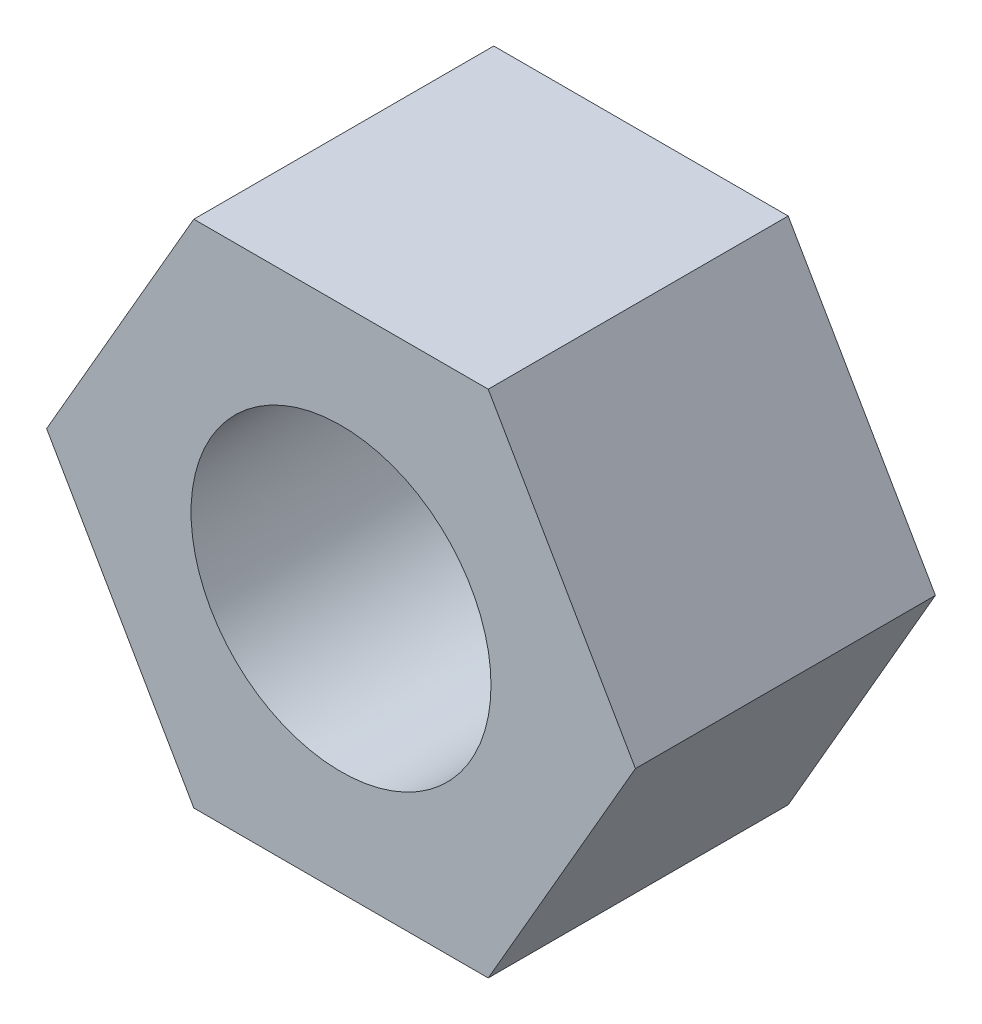
ISO-10303-21;
HEADER;
FILE_DESCRIPTION(('STEP AP214'),'2;1');
FILE_NAME('part.step','',(''),(''),'','','');
FILE_SCHEMA(('AUTOMOTIVE_DESIGN { 1 0 10303 214 1 1 1 1 }'));
ENDSEC;
DATA;
#1=APPLICATION_CONTEXT('core data for automotive mechanical design processes');
#2=APPLICATION_PROTOCOL_DEFINITION('international standard','automotive_design',2000,#1);
#3=PRODUCT_CONTEXT('',#1,'mechanical');
#4=PRODUCT('Part','Part','',(#3));
#5=PRODUCT_RELATED_PRODUCT_CATEGORY('part','',(#4));
#6=PRODUCT_DEFINITION_FORMATION('','',#4);
#7=PRODUCT_DEFINITION_CONTEXT('part definition',#1,'design');
#8=PRODUCT_DEFINITION('design','',#6,#7);
#9=PRODUCT_DEFINITION_SHAPE('','',#8);
#10=(LENGTH_UNIT() NAMED_UNIT(*) SI_UNIT(.MILLI.,.METRE.));
#11=(NAMED_UNIT(*) PLANE_ANGLE_UNIT() SI_UNIT($,.RADIAN.));
#12=(NAMED_UNIT(*) SI_UNIT($,.STERADIAN.) SOLID_ANGLE_UNIT());
#13=UNCERTAINTY_MEASURE_WITH_UNIT(LENGTH_MEASURE(1.E-05),#10,'distance_accuracy_value','');
#14=(GEOMETRIC_REPRESENTATION_CONTEXT(3) GLOBAL_UNCERTAINTY_ASSIGNED_CONTEXT((#13)) GLOBAL_UNIT_ASSIGNED_CONTEXT((#10,
#11,#12)) REPRESENTATION_CONTEXT('',''));
#15=CARTESIAN_POINT('',(0.,0.,0.));
#16=DIRECTION('',(0.,0.,1.));
#17=DIRECTION('',(1.,0.,0.));
#18=AXIS2_PLACEMENT_3D('',#15,#16,#17);
#19=CARTESIAN_POINT('',(0.,-4.25,-5.));
#20=DIRECTION('',(0.,-1.,0.));
#21=DIRECTION('',(1.,0.,0.));
#22=AXIS2_PLACEMENT_3D('',#19,#20,#21);
#23=PLANE('',#22);
#24=DIRECTION('',(1.,0.,0.));
#25=VECTOR('',#24,1.);
#26=CARTESIAN_POINT('',(0.,-4.25,0.));
#27=LINE('',#26,#25);
#28=CARTESIAN_POINT('',(-2.45373864405591,-4.25,0.));
#29=VERTEX_POINT('',#28);
#30=CARTESIAN_POINT('',(2.45373864405591,-4.25,0.));
#31=VERTEX_POINT('',#30);
#32=EDGE_CURVE('E127',#29,#31,#27,.T.);
#33=ORIENTED_EDGE('',*,*,#32,.F.);
#34=DIRECTION('',(0.,0.,1.));
#35=VECTOR('',#34,1.);
#36=CARTESIAN_POINT('',(-2.45373864405591,-4.25,-5.));
#37=LINE('',#36,#35);
#38=CARTESIAN_POINT('',(-2.45373864405591,-4.25,-5.));
#39=VERTEX_POINT('',#38);
#40=EDGE_CURVE('E11',#39,#29,#37,.T.);
#41=ORIENTED_EDGE('',*,*,#40,.F.);
#42=DIRECTION('',(1.,0.,0.));
#43=VECTOR('',#42,1.);
#44=CARTESIAN_POINT('',(0.,-4.25,-5.));
#45=LINE('',#44,#43);
#46=CARTESIAN_POINT('',(2.45373864405591,-4.25,-5.));
#47=VERTEX_POINT('',#46);
#48=EDGE_CURVE('E146',#39,#47,#45,.T.);
#49=ORIENTED_EDGE('',*,*,#48,.T.);
#50=DIRECTION('',(0.,0.,1.));
#51=VECTOR('',#50,1.);
#52=CARTESIAN_POINT('',(2.45373864405591,-4.25,-5.));
#53=LINE('',#52,#51);
#54=EDGE_CURVE('E42',#47,#31,#53,.T.);
#55=ORIENTED_EDGE('',*,*,#54,.T.);
#56=EDGE_LOOP('',(#33,#41,#49,#55));
#57=FACE_BOUND('',#56,.T.);
#58=ADVANCED_FACE('F38',(#57),#23,.T.);
#59=CARTESIAN_POINT('',(-3.68060796608386,-2.125,-5.));
#60=DIRECTION('',(-0.866025403784438,-0.5,0.));
#61=DIRECTION('',(0.5,-0.866025403784438,0.));
#62=AXIS2_PLACEMENT_3D('',#59,#60,#61);
#63=PLANE('',#62);
#64=DIRECTION('',(0.5,-0.866025403784438,0.));
#65=VECTOR('',#64,1.);
#66=CARTESIAN_POINT('',(-3.68060796608386,-2.125,0.));
#67=LINE('',#66,#65);
#68=CARTESIAN_POINT('',(-4.90747728811182,0.,0.));
#69=VERTEX_POINT('',#68);
#70=EDGE_CURVE('E139',#69,#29,#67,.T.);
#71=ORIENTED_EDGE('',*,*,#70,.F.);
#72=DIRECTION('',(0.,0.,1.));
#73=VECTOR('',#72,1.);
#74=CARTESIAN_POINT('',(-4.90747728811182,0.,-5.));
#75=LINE('',#74,#73);
#76=CARTESIAN_POINT('',(-4.90747728811182,0.,-5.));
#77=VERTEX_POINT('',#76);
#78=EDGE_CURVE('E48',#77,#69,#75,.T.);
#79=ORIENTED_EDGE('',*,*,#78,.F.);
#80=DIRECTION('',(0.5,-0.866025403784438,0.));
#81=VECTOR('',#80,1.);
#82=CARTESIAN_POINT('',(-3.68060796608386,-2.125,-5.));
#83=LINE('',#82,#81);
#84=EDGE_CURVE('E114',#77,#39,#83,.T.);
#85=ORIENTED_EDGE('',*,*,#84,.T.);
#86=ORIENTED_EDGE('',*,*,#40,.T.);
#87=EDGE_LOOP('',(#71,#79,#85,#86));
#88=FACE_BOUND('',#87,.T.);
#89=ADVANCED_FACE('F150',(#88),#63,.T.);
#90=CARTESIAN_POINT('',(-3.68060796608386,2.125,-5.));
#91=DIRECTION('',(-0.866025403784439,0.5,0.));
#92=DIRECTION('',(-0.5,-0.866025403784439,0.));
#93=AXIS2_PLACEMENT_3D('',#90,#91,#92);
#94=PLANE('',#93);
#95=DIRECTION('',(-0.5,-0.866025403784439,0.));
#96=VECTOR('',#95,1.);
#97=CARTESIAN_POINT('',(-3.68060796608386,2.125,0.));
#98=LINE('',#97,#96);
#99=CARTESIAN_POINT('',(-2.45373864405591,4.25,0.));
#100=VERTEX_POINT('',#99);
#101=EDGE_CURVE('E101',#100,#69,#98,.T.);
#102=ORIENTED_EDGE('',*,*,#101,.F.);
#103=DIRECTION('',(0.,0.,1.));
#104=VECTOR('',#103,1.);
#105=CARTESIAN_POINT('',(-2.45373864405591,4.25,-5.));
#106=LINE('',#105,#104);
#107=CARTESIAN_POINT('',(-2.45373864405591,4.25,-5.));
#108=VERTEX_POINT('',#107);
#109=EDGE_CURVE('E96',#108,#100,#106,.T.);
#110=ORIENTED_EDGE('',*,*,#109,.F.);
#111=DIRECTION('',(-0.5,-0.866025403784439,0.));
#112=VECTOR('',#111,1.);
#113=CARTESIAN_POINT('',(-3.68060796608386,2.125,-5.));
#114=LINE('',#113,#112);
#115=EDGE_CURVE('E99',#108,#77,#114,.T.);
#116=ORIENTED_EDGE('',*,*,#115,.T.);
#117=ORIENTED_EDGE('',*,*,#78,.T.);
#118=EDGE_LOOP('',(#102,#110,#116,#117));
#119=FACE_BOUND('',#118,.T.);
#120=ADVANCED_FACE('F98',(#119),#94,.T.);
#121=CARTESIAN_POINT('',(0.,4.25,-5.));
#122=DIRECTION('',(0.,1.,0.));
#123=DIRECTION('',(-1.,0.,0.));
#124=AXIS2_PLACEMENT_3D('',#121,#122,#123);
#125=PLANE('',#124);
#126=DIRECTION('',(-1.,0.,0.));
#127=VECTOR('',#126,1.);
#128=CARTESIAN_POINT('',(0.,4.25,0.));
#129=LINE('',#128,#127);
#130=CARTESIAN_POINT('',(2.45373864405591,4.25,0.));
#131=VERTEX_POINT('',#130);
#132=EDGE_CURVE('E136',#131,#100,#129,.T.);
#133=ORIENTED_EDGE('',*,*,#132,.F.);
#134=DIRECTION('',(0.,0.,1.));
#135=VECTOR('',#134,1.);
#136=CARTESIAN_POINT('',(2.45373864405591,4.25,-5.));
#137=LINE('',#136,#135);
#138=CARTESIAN_POINT('',(2.45373864405591,4.25,-5.));
#139=VERTEX_POINT('',#138);
#140=EDGE_CURVE('E106',#139,#131,#137,.T.);
#141=ORIENTED_EDGE('',*,*,#140,.F.);
#142=DIRECTION('',(-1.,0.,0.));
#143=VECTOR('',#142,1.);
#144=CARTESIAN_POINT('',(0.,4.25,-5.));
#145=LINE('',#144,#143);
#146=EDGE_CURVE('E112',#139,#108,#145,.T.);
#147=ORIENTED_EDGE('',*,*,#146,.T.);
#148=ORIENTED_EDGE('',*,*,#109,.T.);
#149=EDGE_LOOP('',(#133,#141,#147,#148));
#150=FACE_BOUND('',#149,.T.);
#151=ADVANCED_FACE('F116',(#150),#125,.T.);
#152=CARTESIAN_POINT('',(3.68060796608386,2.125,-5.));
#153=DIRECTION('',(0.866025403784438,0.5,0.));
#154=DIRECTION('',(-0.5,0.866025403784438,0.));
#155=AXIS2_PLACEMENT_3D('',#152,#153,#154);
#156=PLANE('',#155);
#157=DIRECTION('',(-0.5,0.866025403784439,0.));
#158=VECTOR('',#157,1.);
#159=CARTESIAN_POINT('',(3.68060796608386,2.125,0.));
#160=LINE('',#159,#158);
#161=CARTESIAN_POINT('',(4.90747728811182,0.,0.));
#162=VERTEX_POINT('',#161);
#163=EDGE_CURVE('E133',#162,#131,#160,.T.);
#164=ORIENTED_EDGE('',*,*,#163,.F.);
#165=DIRECTION('',(0.,0.,1.));
#166=VECTOR('',#165,1.);
#167=CARTESIAN_POINT('',(4.90747728811182,0.,-5.));
#168=LINE('',#167,#166);
#169=CARTESIAN_POINT('',(4.90747728811182,0.,-5.));
#170=VERTEX_POINT('',#169);
#171=EDGE_CURVE('E144',#170,#162,#168,.T.);
#172=ORIENTED_EDGE('',*,*,#171,.F.);
#173=DIRECTION('',(-0.5,0.866025403784439,0.));
#174=VECTOR('',#173,1.);
#175=CARTESIAN_POINT('',(3.68060796608386,2.125,-5.));
#176=LINE('',#175,#174);
#177=EDGE_CURVE('E117',#170,#139,#176,.T.);
#178=ORIENTED_EDGE('',*,*,#177,.T.);
#179=ORIENTED_EDGE('',*,*,#140,.T.);
#180=EDGE_LOOP('',(#164,#172,#178,#179));
#181=FACE_BOUND('',#180,.T.);
#182=ADVANCED_FACE('F163',(#181),#156,.T.);
#183=CARTESIAN_POINT('',(0.,0.,-5.));
#184=DIRECTION('',(0.,0.,1.));
#185=DIRECTION('',(1.,0.,0.));
#186=AXIS2_PLACEMENT_3D('',#183,#184,#185);
#187=CYLINDRICAL_SURFACE('',#186,2.5);
#188=CARTESIAN_POINT('',(0.,0.,-5.));
#189=DIRECTION('',(0.,0.,1.));
#190=DIRECTION('',(1.,0.,0.));
#191=AXIS2_PLACEMENT_3D('',#188,#189,#190);
#192=CIRCLE('',#191,2.5);
#193=CARTESIAN_POINT('',(2.5,0.,-5.));
#194=VERTEX_POINT('',#193);
#195=EDGE_CURVE('E141',#194,#194,#192,.T.);
#196=ORIENTED_EDGE('',*,*,#195,.F.);
#197=EDGE_LOOP('',(#196));
#198=FACE_BOUND('',#197,.T.);
#199=CARTESIAN_POINT('',(0.,0.,0.));
#200=DIRECTION('',(0.,0.,1.));
#201=DIRECTION('',(1.,0.,0.));
#202=AXIS2_PLACEMENT_3D('',#199,#200,#201);
#203=CIRCLE('',#202,2.5);
#204=CARTESIAN_POINT('',(2.5,0.,0.));
#205=VERTEX_POINT('',#204);
#206=EDGE_CURVE('E124',#205,#205,#203,.T.);
#207=ORIENTED_EDGE('',*,*,#206,.T.);
#208=EDGE_LOOP('',(#207));
#209=FACE_BOUND('',#208,.T.);
#210=ADVANCED_FACE('F40',(#198,#209),#187,.F.);
#211=CARTESIAN_POINT('',(3.68060796608386,-2.125,-5.));
#212=DIRECTION('',(0.866025403784439,-0.499999999999999,0.));
#213=DIRECTION('',(0.499999999999999,0.866025403784439,0.));
#214=AXIS2_PLACEMENT_3D('',#211,#212,#213);
#215=PLANE('',#214);
#216=DIRECTION('',(0.499999999999999,0.866025403784439,0.));
#217=VECTOR('',#216,1.);
#218=CARTESIAN_POINT('',(3.68060796608386,-2.125,0.));
#219=LINE('',#218,#217);
#220=EDGE_CURVE('E130',#31,#162,#219,.T.);
#221=ORIENTED_EDGE('',*,*,#220,.F.);
#222=ORIENTED_EDGE('',*,*,#54,.F.);
#223=DIRECTION('',(0.499999999999999,0.866025403784439,0.));
#224=VECTOR('',#223,1.);
#225=CARTESIAN_POINT('',(3.68060796608386,-2.125,-5.));
#226=LINE('',#225,#224);
#227=EDGE_CURVE('E119',#47,#170,#226,.T.);
#228=ORIENTED_EDGE('',*,*,#227,.T.);
#229=ORIENTED_EDGE('',*,*,#171,.T.);
#230=EDGE_LOOP('',(#221,#222,#228,#229));
#231=FACE_BOUND('',#230,.T.);
#232=ADVANCED_FACE('F147',(#231),#215,.T.);
#233=CARTESIAN_POINT('',(0.,0.,-5.));
#234=DIRECTION('',(0.,0.,1.));
#235=DIRECTION('',(1.,0.,0.));
#236=AXIS2_PLACEMENT_3D('',#233,#234,#235);
#237=PLANE('',#236);
#238=ORIENTED_EDGE('',*,*,#195,.T.);
#239=EDGE_LOOP('',(#238));
#240=FACE_BOUND('',#239,.T.);
#241=ORIENTED_EDGE('',*,*,#48,.F.);
#242=ORIENTED_EDGE('',*,*,#84,.F.);
#243=ORIENTED_EDGE('',*,*,#115,.F.);
#244=ORIENTED_EDGE('',*,*,#146,.F.);
#245=ORIENTED_EDGE('',*,*,#177,.F.);
#246=ORIENTED_EDGE('',*,*,#227,.F.);
#247=EDGE_LOOP('',(#241,#242,#243,#244,#245,#246));
#248=FACE_BOUND('',#247,.T.);
#249=ADVANCED_FACE('F110',(#240,#248),#237,.F.);
#250=CARTESIAN_POINT('',(0.,0.,0.));
#251=DIRECTION('',(0.,0.,1.));
#252=DIRECTION('',(1.,0.,0.));
#253=AXIS2_PLACEMENT_3D('',#250,#251,#252);
#254=PLANE('',#253);
#255=ORIENTED_EDGE('',*,*,#206,.F.);
#256=EDGE_LOOP('',(#255));
#257=FACE_BOUND('',#256,.T.);
#258=ORIENTED_EDGE('',*,*,#32,.T.);
#259=ORIENTED_EDGE('',*,*,#220,.T.);
#260=ORIENTED_EDGE('',*,*,#163,.T.);
#261=ORIENTED_EDGE('',*,*,#132,.T.);
#262=ORIENTED_EDGE('',*,*,#101,.T.);
#263=ORIENTED_EDGE('',*,*,#70,.T.);
#264=EDGE_LOOP('',(#258,#259,#260,#261,#262,#263));
#265=FACE_BOUND('',#264,.T.);
#266=ADVANCED_FACE('F149',(#257,#265),#254,.T.);
#267=CLOSED_SHELL('',(#58,#89,#120,#151,#182,#210,#232,#249,#266));
#268=MANIFOLD_SOLID_BREP('B2',#267);
#269=ADVANCED_BREP_SHAPE_REPRESENTATION('',(#18,#268),#14);
#270=SHAPE_DEFINITION_REPRESENTATION(#9,#269);
ENDSEC;
END-ISO-10303-21;
